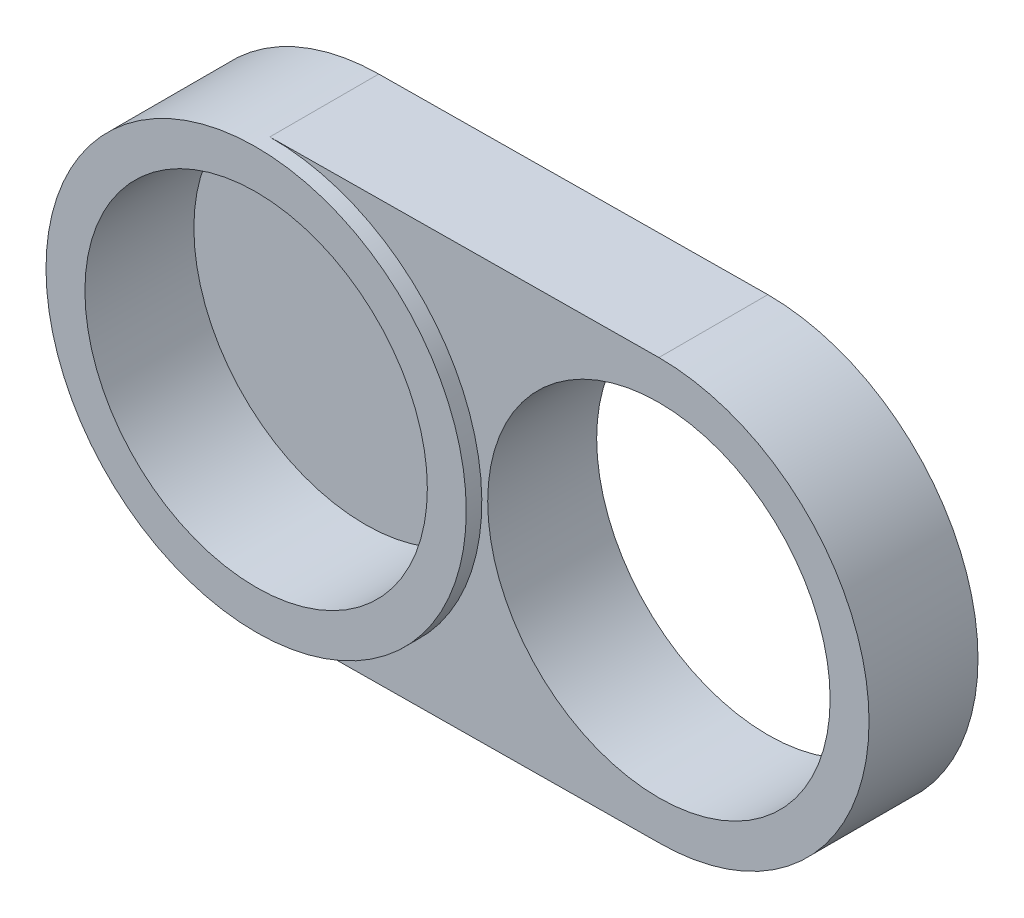
ISO-10303-21;
HEADER;
FILE_DESCRIPTION(('STEP AP214'),'2;1');
FILE_NAME('part.step','',(''),(''),'','','');
FILE_SCHEMA(('AUTOMOTIVE_DESIGN { 1 0 10303 214 1 1 1 1 }'));
ENDSEC;
DATA;
#1=APPLICATION_CONTEXT('core data for automotive mechanical design processes');
#2=APPLICATION_PROTOCOL_DEFINITION('international standard','automotive_design',2000,#1);
#3=PRODUCT_CONTEXT('',#1,'mechanical');
#4=PRODUCT('Part','Part','',(#3));
#5=PRODUCT_RELATED_PRODUCT_CATEGORY('part','',(#4));
#6=PRODUCT_DEFINITION_FORMATION('','',#4);
#7=PRODUCT_DEFINITION_CONTEXT('part definition',#1,'design');
#8=PRODUCT_DEFINITION('design','',#6,#7);
#9=PRODUCT_DEFINITION_SHAPE('','',#8);
#10=(LENGTH_UNIT() NAMED_UNIT(*) SI_UNIT(.MILLI.,.METRE.));
#11=(NAMED_UNIT(*) PLANE_ANGLE_UNIT() SI_UNIT($,.RADIAN.));
#12=(NAMED_UNIT(*) SI_UNIT($,.STERADIAN.) SOLID_ANGLE_UNIT());
#13=UNCERTAINTY_MEASURE_WITH_UNIT(LENGTH_MEASURE(1.E-05),#10,'distance_accuracy_value','');
#14=(GEOMETRIC_REPRESENTATION_CONTEXT(3) GLOBAL_UNCERTAINTY_ASSIGNED_CONTEXT((#13)) GLOBAL_UNIT_ASSIGNED_CONTEXT((#10,
#11,#12)) REPRESENTATION_CONTEXT('',''));
#15=CARTESIAN_POINT('',(0.,0.,0.));
#16=DIRECTION('',(0.,0.,1.));
#17=DIRECTION('',(1.,0.,0.));
#18=AXIS2_PLACEMENT_3D('',#15,#16,#17);
#19=CARTESIAN_POINT('',(-24.8776256631586,-0.226073794778273,7.));
#20=DIRECTION('',(0.,0.,-1.));
#21=DIRECTION('',(-1.,0.,0.));
#22=AXIS2_PLACEMENT_3D('',#19,#20,#21);
#23=CYLINDRICAL_SURFACE('',#22,11.);
#24=CARTESIAN_POINT('',(-24.8776256631586,-0.226073794778273,1.));
#25=DIRECTION('',(0.,0.,-1.));
#26=DIRECTION('',(-1.,0.,0.));
#27=AXIS2_PLACEMENT_3D('',#24,#25,#26);
#28=CIRCLE('',#27,11.);
#29=CARTESIAN_POINT('',(-35.8776256631585,-0.226073794778273,1.));
#30=VERTEX_POINT('',#29);
#31=EDGE_CURVE('E156',#30,#30,#28,.T.);
#32=ORIENTED_EDGE('',*,*,#31,.T.);
#33=EDGE_LOOP('',(#32));
#34=FACE_BOUND('',#33,.T.);
#35=CARTESIAN_POINT('',(-24.8776256631586,-0.226073794778273,8.));
#36=DIRECTION('',(0.,0.,1.));
#37=DIRECTION('',(1.,0.,0.));
#38=AXIS2_PLACEMENT_3D('',#35,#36,#37);
#39=CIRCLE('',#38,11.);
#40=CARTESIAN_POINT('',(-13.8776256631586,-0.226073794778273,8.));
#41=VERTEX_POINT('',#40);
#42=EDGE_CURVE('E159',#41,#41,#39,.T.);
#43=ORIENTED_EDGE('',*,*,#42,.T.);
#44=EDGE_LOOP('',(#43));
#45=FACE_BOUND('',#44,.T.);
#46=ADVANCED_FACE('F35',(#34,#45),#23,.F.);
#47=CARTESIAN_POINT('',(-24.8776256631586,-0.226073794778273,1.));
#48=DIRECTION('',(0.,0.,-1.));
#49=DIRECTION('',(-1.,0.,0.));
#50=AXIS2_PLACEMENT_3D('',#47,#48,#49);
#51=PLANE('',#50);
#52=ORIENTED_EDGE('',*,*,#31,.F.);
#53=EDGE_LOOP('',(#52));
#54=FACE_BOUND('',#53,.T.);
#55=ADVANCED_FACE('F146',(#54),#51,.F.);
#56=CARTESIAN_POINT('',(-24.8776256631586,-0.226073794778273,8.));
#57=DIRECTION('',(0.,0.,1.));
#58=DIRECTION('',(1.,0.,0.));
#59=AXIS2_PLACEMENT_3D('',#56,#57,#58);
#60=PLANE('',#59);
#61=CARTESIAN_POINT('',(-24.8776256631586,-0.226073794778273,8.));
#62=DIRECTION('',(0.,0.,1.));
#63=DIRECTION('',(1.,0.,0.));
#64=AXIS2_PLACEMENT_3D('',#61,#62,#63);
#65=CIRCLE('',#64,13.5);
#66=CARTESIAN_POINT('',(-11.3776256631586,-0.226073794778273,8.));
#67=VERTEX_POINT('',#66);
#68=EDGE_CURVE('E161',#67,#67,#65,.T.);
#69=ORIENTED_EDGE('',*,*,#68,.T.);
#70=EDGE_LOOP('',(#69));
#71=FACE_BOUND('',#70,.T.);
#72=ORIENTED_EDGE('',*,*,#42,.F.);
#73=EDGE_LOOP('',(#72));
#74=FACE_BOUND('',#73,.T.);
#75=ADVANCED_FACE('F141',(#71,#74),#60,.T.);
#76=CARTESIAN_POINT('',(0.,0.,0.));
#77=DIRECTION('',(0.,0.,1.));
#78=DIRECTION('',(1.,0.,0.));
#79=AXIS2_PLACEMENT_3D('',#76,#77,#78);
#80=PLANE('',#79);
#81=CARTESIAN_POINT('',(0.,0.,0.));
#82=DIRECTION('',(0.,0.,1.));
#83=DIRECTION('',(1.,0.,0.));
#84=AXIS2_PLACEMENT_3D('',#81,#82,#83);
#85=CIRCLE('',#84,11.);
#86=CARTESIAN_POINT('',(11.,0.,0.));
#87=VERTEX_POINT('',#86);
#88=EDGE_CURVE('E167',#87,#87,#85,.T.);
#89=ORIENTED_EDGE('',*,*,#88,.T.);
#90=EDGE_LOOP('',(#89));
#91=FACE_BOUND('',#90,.T.);
#92=DIRECTION('',(-0.999958914167452,-0.00906476569195909,0.));
#93=VECTOR('',#92,1.);
#94=CARTESIAN_POINT('',(-0.122369308989936,13.4988907053098,0.));
#95=LINE('',#94,#93);
#96=CARTESIAN_POINT('',(0.,13.5,0.));
#97=VERTEX_POINT('',#96);
#98=CARTESIAN_POINT('',(-25.,13.2733715464823,0.));
#99=VERTEX_POINT('',#98);
#100=EDGE_CURVE('E94',#97,#99,#95,.T.);
#101=ORIENTED_EDGE('',*,*,#100,.F.);
#102=CARTESIAN_POINT('',(0.,0.,0.));
#103=DIRECTION('',(0.,0.,1.));
#104=DIRECTION('',(1.,0.,0.));
#105=AXIS2_PLACEMENT_3D('',#102,#103,#104);
#106=CIRCLE('',#105,13.5);
#107=CARTESIAN_POINT('',(0.,-13.5,0.));
#108=VERTEX_POINT('',#107);
#109=EDGE_CURVE('E77',#108,#97,#106,.T.);
#110=ORIENTED_EDGE('',*,*,#109,.F.);
#111=DIRECTION('',(0.999958711823932,0.009087059338561,0.));
#112=VECTOR('',#111,1.);
#113=CARTESIAN_POINT('',(0.122670236031144,-13.4988852422598,0.));
#114=LINE('',#113,#112);
#115=CARTESIAN_POINT('',(-24.8776256631586,-13.7260737947783,0.));
#116=VERTEX_POINT('',#115);
#117=EDGE_CURVE('E176',#116,#108,#114,.T.);
#118=ORIENTED_EDGE('',*,*,#117,.F.);
#119=CARTESIAN_POINT('',(-24.8776256631586,-0.226073794778273,0.));
#120=DIRECTION('',(0.,0.,1.));
#121=DIRECTION('',(1.,0.,0.));
#122=AXIS2_PLACEMENT_3D('',#119,#120,#121);
#123=CIRCLE('',#122,13.5);
#124=EDGE_CURVE('E174',#99,#116,#123,.T.);
#125=ORIENTED_EDGE('',*,*,#124,.F.);
#126=EDGE_LOOP('',(#101,#110,#118,#125));
#127=FACE_BOUND('',#126,.T.);
#128=ADVANCED_FACE('F136',(#91,#127),#80,.F.);
#129=CARTESIAN_POINT('',(0.,0.,7.));
#130=DIRECTION('',(0.,0.,-1.));
#131=DIRECTION('',(-1.,0.,0.));
#132=AXIS2_PLACEMENT_3D('',#129,#130,#131);
#133=CYLINDRICAL_SURFACE('',#132,11.);
#134=CARTESIAN_POINT('',(0.,0.,7.));
#135=DIRECTION('',(0.,0.,1.));
#136=DIRECTION('',(1.,0.,0.));
#137=AXIS2_PLACEMENT_3D('',#134,#135,#136);
#138=CIRCLE('',#137,11.);
#139=CARTESIAN_POINT('',(11.,0.,7.));
#140=VERTEX_POINT('',#139);
#141=EDGE_CURVE('E99',#140,#140,#138,.T.);
#142=ORIENTED_EDGE('',*,*,#141,.T.);
#143=EDGE_LOOP('',(#142));
#144=FACE_BOUND('',#143,.T.);
#145=ORIENTED_EDGE('',*,*,#88,.F.);
#146=EDGE_LOOP('',(#145));
#147=FACE_BOUND('',#146,.T.);
#148=ADVANCED_FACE('F134',(#144,#147),#133,.F.);
#149=CARTESIAN_POINT('',(-0.122369308989936,13.4988907053098,7.));
#150=DIRECTION('',(0.00906476569195909,-0.999958914167452,0.));
#151=DIRECTION('',(0.999958914167452,0.00906476569195909,0.));
#152=AXIS2_PLACEMENT_3D('',#149,#150,#151);
#153=PLANE('',#152);
#154=ORIENTED_EDGE('',*,*,#100,.T.);
#155=DIRECTION('',(0.,0.,-1.));
#156=VECTOR('',#155,1.);
#157=CARTESIAN_POINT('',(-25.,13.2733715464823,7.));
#158=LINE('',#157,#156);
#159=CARTESIAN_POINT('',(-25.,13.2733715464823,7.));
#160=VERTEX_POINT('',#159);
#161=EDGE_CURVE('E45',#160,#99,#158,.T.);
#162=ORIENTED_EDGE('',*,*,#161,.F.);
#163=DIRECTION('',(-0.999958914167452,-0.00906476569195909,0.));
#164=VECTOR('',#163,1.);
#165=CARTESIAN_POINT('',(-0.122369308989936,13.4988907053098,7.));
#166=LINE('',#165,#164);
#167=CARTESIAN_POINT('',(0.,13.5,7.));
#168=VERTEX_POINT('',#167);
#169=EDGE_CURVE('E92',#168,#160,#166,.T.);
#170=ORIENTED_EDGE('',*,*,#169,.F.);
#171=DIRECTION('',(0.,0.,-1.));
#172=VECTOR('',#171,1.);
#173=CARTESIAN_POINT('',(0.,13.5,7.));
#174=LINE('',#173,#172);
#175=EDGE_CURVE('E170',#168,#97,#174,.T.);
#176=ORIENTED_EDGE('',*,*,#175,.T.);
#177=EDGE_LOOP('',(#154,#162,#170,#176));
#178=FACE_BOUND('',#177,.T.);
#179=ADVANCED_FACE('F91',(#178),#153,.F.);
#180=CARTESIAN_POINT('',(0.,0.,7.));
#181=DIRECTION('',(0.,0.,-1.));
#182=DIRECTION('',(-1.,0.,0.));
#183=AXIS2_PLACEMENT_3D('',#180,#181,#182);
#184=CYLINDRICAL_SURFACE('',#183,13.5);
#185=ORIENTED_EDGE('',*,*,#109,.T.);
#186=ORIENTED_EDGE('',*,*,#175,.F.);
#187=CARTESIAN_POINT('',(0.,0.,7.));
#188=DIRECTION('',(0.,0.,1.));
#189=DIRECTION('',(1.,0.,0.));
#190=AXIS2_PLACEMENT_3D('',#187,#188,#189);
#191=CIRCLE('',#190,13.5);
#192=CARTESIAN_POINT('',(0.,-13.5,7.));
#193=VERTEX_POINT('',#192);
#194=EDGE_CURVE('E57',#193,#168,#191,.T.);
#195=ORIENTED_EDGE('',*,*,#194,.F.);
#196=DIRECTION('',(0.,0.,-1.));
#197=VECTOR('',#196,1.);
#198=CARTESIAN_POINT('',(0.,-13.5,7.));
#199=LINE('',#198,#197);
#200=EDGE_CURVE('E179',#193,#108,#199,.T.);
#201=ORIENTED_EDGE('',*,*,#200,.T.);
#202=EDGE_LOOP('',(#185,#186,#195,#201));
#203=FACE_BOUND('',#202,.T.);
#204=ADVANCED_FACE('F128',(#203),#184,.T.);
#205=CARTESIAN_POINT('',(-24.8776256631586,-0.226073794778273,7.));
#206=DIRECTION('',(0.,0.,-1.));
#207=DIRECTION('',(-1.,0.,0.));
#208=AXIS2_PLACEMENT_3D('',#205,#206,#207);
#209=CYLINDRICAL_SURFACE('',#208,13.5);
#210=ORIENTED_EDGE('',*,*,#124,.T.);
#211=DIRECTION('',(0.,0.,-1.));
#212=VECTOR('',#211,1.);
#213=CARTESIAN_POINT('',(-24.8776256631586,-13.7260737947783,7.));
#214=LINE('',#213,#212);
#215=CARTESIAN_POINT('',(-24.8776256631586,-13.7260737947783,7.));
#216=VERTEX_POINT('',#215);
#217=EDGE_CURVE('E83',#216,#116,#214,.T.);
#218=ORIENTED_EDGE('',*,*,#217,.F.);
#219=CARTESIAN_POINT('',(-24.8776256631586,-0.226073794778273,7.));
#220=DIRECTION('',(0.,0.,1.));
#221=DIRECTION('',(0.,-1.,0.));
#222=AXIS2_PLACEMENT_3D('',#219,#220,#221);
#223=CIRCLE('',#222,13.5);
#224=CARTESIAN_POINT('',(-24.6322851910965,-13.7238442792979,7.));
#225=VERTEX_POINT('',#224);
#226=EDGE_CURVE('E103',#216,#225,#223,.T.);
#227=ORIENTED_EDGE('',*,*,#226,.T.);
#228=CARTESIAN_POINT('',(-24.8776256631586,-0.226073794778273,7.));
#229=DIRECTION('',(0.,0.,1.));
#230=DIRECTION('',(1.,0.,0.));
#231=AXIS2_PLACEMENT_3D('',#228,#229,#230);
#232=CIRCLE('',#231,13.5);
#233=EDGE_CURVE('E11',#225,#160,#232,.T.);
#234=ORIENTED_EDGE('',*,*,#233,.T.);
#235=ORIENTED_EDGE('',*,*,#161,.T.);
#236=EDGE_LOOP('',(#210,#218,#227,#234,#235));
#237=FACE_BOUND('',#236,.T.);
#238=ORIENTED_EDGE('',*,*,#68,.F.);
#239=EDGE_LOOP('',(#238));
#240=FACE_BOUND('',#239,.T.);
#241=ADVANCED_FACE('F101',(#237,#240),#209,.T.);
#242=CARTESIAN_POINT('',(0.,0.,7.));
#243=DIRECTION('',(0.,0.,1.));
#244=DIRECTION('',(1.,0.,0.));
#245=AXIS2_PLACEMENT_3D('',#242,#243,#244);
#246=PLANE('',#245);
#247=ORIENTED_EDGE('',*,*,#233,.F.);
#248=DIRECTION('',(0.999958711823932,0.009087059338561,0.));
#249=VECTOR('',#248,1.);
#250=CARTESIAN_POINT('',(0.122670236031144,-13.4988852422598,7.));
#251=LINE('',#250,#249);
#252=EDGE_CURVE('E98',#225,#193,#251,.T.);
#253=ORIENTED_EDGE('',*,*,#252,.T.);
#254=ORIENTED_EDGE('',*,*,#194,.T.);
#255=ORIENTED_EDGE('',*,*,#169,.T.);
#256=EDGE_LOOP('',(#247,#253,#254,#255));
#257=FACE_BOUND('',#256,.T.);
#258=ORIENTED_EDGE('',*,*,#141,.F.);
#259=EDGE_LOOP('',(#258));
#260=FACE_BOUND('',#259,.T.);
#261=ADVANCED_FACE('F96',(#257,#260),#246,.T.);
#262=CARTESIAN_POINT('',(0.122670236031144,-13.4988852422598,7.));
#263=DIRECTION('',(-0.009087059338561,0.999958711823932,0.));
#264=DIRECTION('',(-0.999958711823932,-0.009087059338561,0.));
#265=AXIS2_PLACEMENT_3D('',#262,#263,#264);
#266=PLANE('',#265);
#267=ORIENTED_EDGE('',*,*,#117,.T.);
#268=ORIENTED_EDGE('',*,*,#200,.F.);
#269=ORIENTED_EDGE('',*,*,#252,.F.);
#270=ORIENTED_EDGE('',*,*,#226,.F.);
#271=ORIENTED_EDGE('',*,*,#217,.T.);
#272=EDGE_LOOP('',(#267,#268,#269,#270,#271));
#273=FACE_BOUND('',#272,.T.);
#274=ADVANCED_FACE('F119',(#273),#266,.F.);
#275=CLOSED_SHELL('',(#46,#55,#75,#128,#148,#179,#204,#241,#261,#274));
#276=MANIFOLD_SOLID_BREP('B2',#275);
#277=ADVANCED_BREP_SHAPE_REPRESENTATION('',(#18,#276),#14);
#278=SHAPE_DEFINITION_REPRESENTATION(#9,#277);
ENDSEC;
END-ISO-10303-21;
